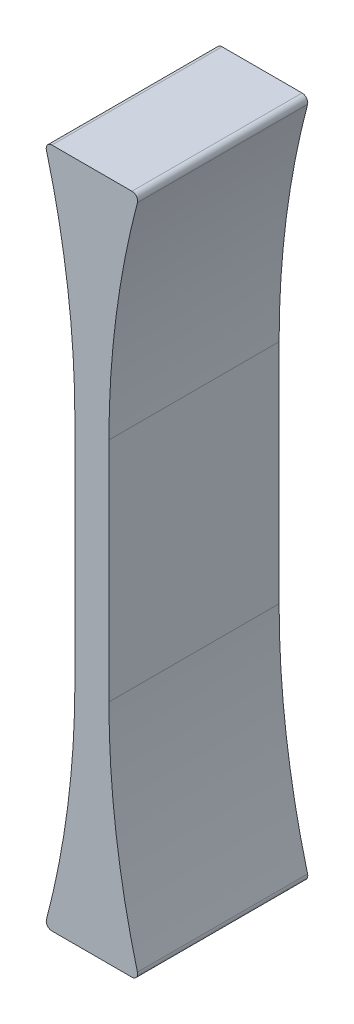
ISO-10303-21;
HEADER;
FILE_DESCRIPTION(('STEP AP214'),'2;1');
FILE_NAME('part.step','',(''),(''),'','','');
FILE_SCHEMA(('AUTOMOTIVE_DESIGN { 1 0 10303 214 1 1 1 1 }'));
ENDSEC;
DATA;
#1=APPLICATION_CONTEXT('core data for automotive mechanical design processes');
#2=APPLICATION_PROTOCOL_DEFINITION('international standard','automotive_design',2000,#1);
#3=PRODUCT_CONTEXT('',#1,'mechanical');
#4=PRODUCT('Part','Part','',(#3));
#5=PRODUCT_RELATED_PRODUCT_CATEGORY('part','',(#4));
#6=PRODUCT_DEFINITION_FORMATION('','',#4);
#7=PRODUCT_DEFINITION_CONTEXT('part definition',#1,'design');
#8=PRODUCT_DEFINITION('design','',#6,#7);
#9=PRODUCT_DEFINITION_SHAPE('','',#8);
#10=(LENGTH_UNIT() NAMED_UNIT(*) SI_UNIT(.MILLI.,.METRE.));
#11=(NAMED_UNIT(*) PLANE_ANGLE_UNIT() SI_UNIT($,.RADIAN.));
#12=(NAMED_UNIT(*) SI_UNIT($,.STERADIAN.) SOLID_ANGLE_UNIT());
#13=UNCERTAINTY_MEASURE_WITH_UNIT(LENGTH_MEASURE(1.E-05),#10,'distance_accuracy_value','');
#14=(GEOMETRIC_REPRESENTATION_CONTEXT(3) GLOBAL_UNCERTAINTY_ASSIGNED_CONTEXT((#13)) GLOBAL_UNIT_ASSIGNED_CONTEXT((#10,
#11,#12)) REPRESENTATION_CONTEXT('',''));
#15=CARTESIAN_POINT('',(0.,0.,0.));
#16=DIRECTION('',(0.,0.,1.));
#17=DIRECTION('',(1.,0.,0.));
#18=AXIS2_PLACEMENT_3D('',#15,#16,#17);
#19=CARTESIAN_POINT('',(1.5,0.,15.));
#20=DIRECTION('',(-1.,0.,0.));
#21=DIRECTION('',(0.,0.,1.));
#22=AXIS2_PLACEMENT_3D('',#19,#20,#21);
#23=PLANE('',#22);
#24=DIRECTION('',(0.,1.,0.));
#25=VECTOR('',#24,1.);
#26=CARTESIAN_POINT('',(1.5,0.,0.));
#27=LINE('',#26,#25);
#28=CARTESIAN_POINT('',(1.5,-10.,0.));
#29=VERTEX_POINT('',#28);
#30=CARTESIAN_POINT('',(1.5,10.,0.));
#31=VERTEX_POINT('',#30);
#32=EDGE_CURVE('E197',#29,#31,#27,.T.);
#33=ORIENTED_EDGE('',*,*,#32,.T.);
#34=DIRECTION('',(0.,0.,-1.));
#35=VECTOR('',#34,1.);
#36=CARTESIAN_POINT('',(1.5,10.,15.));
#37=LINE('',#36,#35);
#38=CARTESIAN_POINT('',(1.5,10.,15.));
#39=VERTEX_POINT('',#38);
#40=EDGE_CURVE('E209',#39,#31,#37,.T.);
#41=ORIENTED_EDGE('',*,*,#40,.F.);
#42=DIRECTION('',(0.,1.,0.));
#43=VECTOR('',#42,1.);
#44=CARTESIAN_POINT('',(1.5,0.,15.));
#45=LINE('',#44,#43);
#46=CARTESIAN_POINT('',(1.5,-10.,15.));
#47=VERTEX_POINT('',#46);
#48=EDGE_CURVE('E198',#47,#39,#45,.T.);
#49=ORIENTED_EDGE('',*,*,#48,.F.);
#50=DIRECTION('',(0.,0.,-1.));
#51=VECTOR('',#50,1.);
#52=CARTESIAN_POINT('',(1.5,-10.,15.));
#53=LINE('',#52,#51);
#54=EDGE_CURVE('E177',#47,#29,#53,.T.);
#55=ORIENTED_EDGE('',*,*,#54,.T.);
#56=EDGE_LOOP('',(#33,#41,#49,#55));
#57=FACE_BOUND('',#56,.T.);
#58=ADVANCED_FACE('F45',(#57),#23,.F.);
#59=CARTESIAN_POINT('',(77.5,10.,15.));
#60=DIRECTION('',(0.,0.,-1.));
#61=DIRECTION('',(-1.,0.,0.));
#62=AXIS2_PLACEMENT_3D('',#59,#60,#61);
#63=CYLINDRICAL_SURFACE('',#62,76.);
#64=CARTESIAN_POINT('',(77.5,10.,0.));
#65=DIRECTION('',(0.,0.,-1.));
#66=DIRECTION('',(-1.,0.,0.));
#67=AXIS2_PLACEMENT_3D('',#64,#65,#66);
#68=CIRCLE('',#67,76.);
#69=CARTESIAN_POINT('',(4.01051541558553,29.3725490196078,0.));
#70=VERTEX_POINT('',#69);
#71=EDGE_CURVE('E212',#31,#70,#68,.T.);
#72=ORIENTED_EDGE('',*,*,#71,.T.);
#73=DIRECTION('',(0.,0.,-1.));
#74=VECTOR('',#73,1.);
#75=CARTESIAN_POINT('',(4.01051541558554,29.3725490196078,15.));
#76=LINE('',#75,#74);
#77=CARTESIAN_POINT('',(4.01051541558553,29.3725490196078,15.));
#78=VERTEX_POINT('',#77);
#79=EDGE_CURVE('E11',#70,#78,#76,.F.);
#80=ORIENTED_EDGE('',*,*,#79,.T.);
#81=CARTESIAN_POINT('',(77.5,10.,15.));
#82=DIRECTION('',(0.,0.,-1.));
#83=DIRECTION('',(-1.,0.,0.));
#84=AXIS2_PLACEMENT_3D('',#81,#82,#83);
#85=CIRCLE('',#84,76.);
#86=EDGE_CURVE('E201',#39,#78,#85,.T.);
#87=ORIENTED_EDGE('',*,*,#86,.F.);
#88=ORIENTED_EDGE('',*,*,#40,.T.);
#89=EDGE_LOOP('',(#72,#80,#87,#88));
#90=FACE_BOUND('',#89,.T.);
#91=ADVANCED_FACE('F298',(#90),#63,.F.);
#92=CARTESIAN_POINT('',(4.17878888070656,30.,15.));
#93=DIRECTION('',(0.,-1.,0.));
#94=DIRECTION('',(0.,0.,-1.));
#95=AXIS2_PLACEMENT_3D('',#92,#93,#94);
#96=PLANE('',#95);
#97=DIRECTION('',(-1.,0.,0.));
#98=VECTOR('',#97,1.);
#99=CARTESIAN_POINT('',(4.17878888070656,30.,0.));
#100=LINE('',#99,#98);
#101=CARTESIAN_POINT('',(3.52703196437228,30.,0.));
#102=VERTEX_POINT('',#101);
#103=CARTESIAN_POINT('',(-3.52703196437229,30.,0.));
#104=VERTEX_POINT('',#103);
#105=EDGE_CURVE('E202',#102,#104,#100,.T.);
#106=ORIENTED_EDGE('',*,*,#105,.T.);
#107=DIRECTION('',(0.,0.,1.));
#108=VECTOR('',#107,1.);
#109=CARTESIAN_POINT('',(-3.52703196437229,30.,15.));
#110=LINE('',#109,#108);
#111=CARTESIAN_POINT('',(-3.52703196437229,30.,15.));
#112=VERTEX_POINT('',#111);
#113=EDGE_CURVE('E54',#104,#112,#110,.T.);
#114=ORIENTED_EDGE('',*,*,#113,.T.);
#115=DIRECTION('',(-1.,0.,0.));
#116=VECTOR('',#115,1.);
#117=CARTESIAN_POINT('',(4.17878888070656,30.,15.));
#118=LINE('',#117,#116);
#119=CARTESIAN_POINT('',(3.52703196437228,30.,15.));
#120=VERTEX_POINT('',#119);
#121=EDGE_CURVE('E205',#120,#112,#118,.T.);
#122=ORIENTED_EDGE('',*,*,#121,.F.);
#123=DIRECTION('',(0.,0.,-1.));
#124=VECTOR('',#123,1.);
#125=CARTESIAN_POINT('',(3.52703196437228,30.,15.));
#126=LINE('',#125,#124);
#127=EDGE_CURVE('E261',#120,#102,#126,.T.);
#128=ORIENTED_EDGE('',*,*,#127,.T.);
#129=EDGE_LOOP('',(#106,#114,#122,#128));
#130=FACE_BOUND('',#129,.T.);
#131=ADVANCED_FACE('F268',(#130),#96,.F.);
#132=CARTESIAN_POINT('',(77.5,10.,15.));
#133=DIRECTION('',(0.,0.,-1.));
#134=DIRECTION('',(-1.,0.,0.));
#135=AXIS2_PLACEMENT_3D('',#132,#133,#134);
#136=PLANE('',#135);
#137=CARTESIAN_POINT('',(-77.5,-10.,15.));
#138=DIRECTION('',(0.,0.,-1.));
#139=DIRECTION('',(1.,0.,0.));
#140=AXIS2_PLACEMENT_3D('',#137,#138,#139);
#141=CIRCLE('',#140,76.);
#142=CARTESIAN_POINT('',(-1.5,-10.,15.));
#143=VERTEX_POINT('',#142);
#144=CARTESIAN_POINT('',(-4.01051541558554,-29.3725490196078,15.));
#145=VERTEX_POINT('',#144);
#146=EDGE_CURVE('E141',#143,#145,#141,.T.);
#147=ORIENTED_EDGE('',*,*,#146,.T.);
#148=CARTESIAN_POINT('',(-3.52703196437229,-29.5,15.));
#149=DIRECTION('',(0.,0.,-1.));
#150=DIRECTION('',(-1.,0.,0.));
#151=AXIS2_PLACEMENT_3D('',#148,#149,#150);
#152=CIRCLE('',#151,0.5);
#153=CARTESIAN_POINT('',(-3.52703196437229,-30.,15.));
#154=VERTEX_POINT('',#153);
#155=EDGE_CURVE('E250',#145,#154,#152,.F.);
#156=ORIENTED_EDGE('',*,*,#155,.T.);
#157=DIRECTION('',(-1.,0.,0.));
#158=VECTOR('',#157,1.);
#159=CARTESIAN_POINT('',(4.17878888070656,-30.,15.));
#160=LINE('',#159,#158);
#161=CARTESIAN_POINT('',(3.52703196437228,-30.,15.));
#162=VERTEX_POINT('',#161);
#163=EDGE_CURVE('E172',#162,#154,#160,.T.);
#164=ORIENTED_EDGE('',*,*,#163,.F.);
#165=CARTESIAN_POINT('',(3.52703196437228,-29.5,15.));
#166=DIRECTION('',(0.,0.,-1.));
#167=DIRECTION('',(-1.,0.,0.));
#168=AXIS2_PLACEMENT_3D('',#165,#166,#167);
#169=CIRCLE('',#168,0.5);
#170=CARTESIAN_POINT('',(4.01051541558553,-29.3725490196078,15.));
#171=VERTEX_POINT('',#170);
#172=EDGE_CURVE('E67',#162,#171,#169,.F.);
#173=ORIENTED_EDGE('',*,*,#172,.T.);
#174=CARTESIAN_POINT('',(77.5,-10.,15.));
#175=DIRECTION('',(0.,0.,1.));
#176=DIRECTION('',(-1.,0.,0.));
#177=AXIS2_PLACEMENT_3D('',#174,#175,#176);
#178=CIRCLE('',#177,76.);
#179=EDGE_CURVE('E169',#47,#171,#178,.T.);
#180=ORIENTED_EDGE('',*,*,#179,.F.);
#181=ORIENTED_EDGE('',*,*,#48,.T.);
#182=ORIENTED_EDGE('',*,*,#86,.T.);
#183=CARTESIAN_POINT('',(3.52703196437228,29.5,15.));
#184=DIRECTION('',(0.,0.,-1.));
#185=DIRECTION('',(-1.,0.,0.));
#186=AXIS2_PLACEMENT_3D('',#183,#184,#185);
#187=CIRCLE('',#186,0.5);
#188=EDGE_CURVE('E242',#78,#120,#187,.F.);
#189=ORIENTED_EDGE('',*,*,#188,.T.);
#190=ORIENTED_EDGE('',*,*,#121,.T.);
#191=CARTESIAN_POINT('',(-3.52703196437229,29.5,15.));
#192=DIRECTION('',(0.,0.,-1.));
#193=DIRECTION('',(-1.,0.,0.));
#194=AXIS2_PLACEMENT_3D('',#191,#192,#193);
#195=CIRCLE('',#194,0.5);
#196=CARTESIAN_POINT('',(-4.01051541558554,29.3725490196078,15.));
#197=VERTEX_POINT('',#196);
#198=EDGE_CURVE('E245',#112,#197,#195,.F.);
#199=ORIENTED_EDGE('',*,*,#198,.T.);
#200=CARTESIAN_POINT('',(-77.5,10.,15.));
#201=DIRECTION('',(0.,0.,1.));
#202=DIRECTION('',(1.,0.,0.));
#203=AXIS2_PLACEMENT_3D('',#200,#201,#202);
#204=CIRCLE('',#203,76.);
#205=CARTESIAN_POINT('',(-1.5,10.,15.));
#206=VERTEX_POINT('',#205);
#207=EDGE_CURVE('E144',#206,#197,#204,.T.);
#208=ORIENTED_EDGE('',*,*,#207,.F.);
#209=DIRECTION('',(0.,1.,0.));
#210=VECTOR('',#209,1.);
#211=CARTESIAN_POINT('',(-1.5,0.,15.));
#212=LINE('',#211,#210);
#213=EDGE_CURVE('E137',#143,#206,#212,.T.);
#214=ORIENTED_EDGE('',*,*,#213,.F.);
#215=EDGE_LOOP('',(#147,#156,#164,#173,#180,#181,#182,#189,#190,#199,#208,#214));
#216=FACE_BOUND('',#215,.T.);
#217=ADVANCED_FACE('F139',(#216),#136,.F.);
#218=CARTESIAN_POINT('',(77.5,10.,0.));
#219=DIRECTION('',(0.,0.,-1.));
#220=DIRECTION('',(-1.,0.,0.));
#221=AXIS2_PLACEMENT_3D('',#218,#219,#220);
#222=PLANE('',#221);
#223=DIRECTION('',(-1.,0.,0.));
#224=VECTOR('',#223,1.);
#225=CARTESIAN_POINT('',(4.17878888070656,-30.,0.));
#226=LINE('',#225,#224);
#227=CARTESIAN_POINT('',(3.52703196437228,-30.,0.));
#228=VERTEX_POINT('',#227);
#229=CARTESIAN_POINT('',(-3.52703196437229,-30.,0.));
#230=VERTEX_POINT('',#229);
#231=EDGE_CURVE('E173',#228,#230,#226,.T.);
#232=ORIENTED_EDGE('',*,*,#231,.T.);
#233=CARTESIAN_POINT('',(-3.52703196437229,-29.5,0.));
#234=DIRECTION('',(0.,0.,-1.));
#235=DIRECTION('',(-1.,0.,0.));
#236=AXIS2_PLACEMENT_3D('',#233,#234,#235);
#237=CIRCLE('',#236,0.5);
#238=CARTESIAN_POINT('',(-4.01051541558554,-29.3725490196078,0.));
#239=VERTEX_POINT('',#238);
#240=EDGE_CURVE('E237',#230,#239,#237,.T.);
#241=ORIENTED_EDGE('',*,*,#240,.T.);
#242=CARTESIAN_POINT('',(-77.5,-10.,0.));
#243=DIRECTION('',(0.,0.,-1.));
#244=DIRECTION('',(1.,0.,0.));
#245=AXIS2_PLACEMENT_3D('',#242,#243,#244);
#246=CIRCLE('',#245,76.);
#247=CARTESIAN_POINT('',(-1.5,-10.,0.));
#248=VERTEX_POINT('',#247);
#249=EDGE_CURVE('E164',#248,#239,#246,.T.);
#250=ORIENTED_EDGE('',*,*,#249,.F.);
#251=DIRECTION('',(0.,1.,0.));
#252=VECTOR('',#251,1.);
#253=CARTESIAN_POINT('',(-1.5,0.,0.));
#254=LINE('',#253,#252);
#255=CARTESIAN_POINT('',(-1.5,10.,0.));
#256=VERTEX_POINT('',#255);
#257=EDGE_CURVE('E153',#248,#256,#254,.T.);
#258=ORIENTED_EDGE('',*,*,#257,.T.);
#259=CARTESIAN_POINT('',(-77.5,10.,0.));
#260=DIRECTION('',(0.,0.,1.));
#261=DIRECTION('',(1.,0.,0.));
#262=AXIS2_PLACEMENT_3D('',#259,#260,#261);
#263=CIRCLE('',#262,76.);
#264=CARTESIAN_POINT('',(-4.01051541558554,29.3725490196078,0.));
#265=VERTEX_POINT('',#264);
#266=EDGE_CURVE('E187',#256,#265,#263,.T.);
#267=ORIENTED_EDGE('',*,*,#266,.T.);
#268=CARTESIAN_POINT('',(-3.52703196437229,29.5,0.));
#269=DIRECTION('',(0.,0.,-1.));
#270=DIRECTION('',(-1.,0.,0.));
#271=AXIS2_PLACEMENT_3D('',#268,#269,#270);
#272=CIRCLE('',#271,0.5);
#273=EDGE_CURVE('E231',#265,#104,#272,.T.);
#274=ORIENTED_EDGE('',*,*,#273,.T.);
#275=ORIENTED_EDGE('',*,*,#105,.F.);
#276=CARTESIAN_POINT('',(3.52703196437228,29.5,0.));
#277=DIRECTION('',(0.,0.,-1.));
#278=DIRECTION('',(-1.,0.,0.));
#279=AXIS2_PLACEMENT_3D('',#276,#277,#278);
#280=CIRCLE('',#279,0.5);
#281=EDGE_CURVE('E228',#102,#70,#280,.T.);
#282=ORIENTED_EDGE('',*,*,#281,.T.);
#283=ORIENTED_EDGE('',*,*,#71,.F.);
#284=ORIENTED_EDGE('',*,*,#32,.F.);
#285=CARTESIAN_POINT('',(77.5,-10.,0.));
#286=DIRECTION('',(0.,0.,1.));
#287=DIRECTION('',(-1.,0.,0.));
#288=AXIS2_PLACEMENT_3D('',#285,#286,#287);
#289=CIRCLE('',#288,76.);
#290=CARTESIAN_POINT('',(4.01051541558553,-29.3725490196078,0.));
#291=VERTEX_POINT('',#290);
#292=EDGE_CURVE('E158',#29,#291,#289,.T.);
#293=ORIENTED_EDGE('',*,*,#292,.T.);
#294=CARTESIAN_POINT('',(3.52703196437228,-29.5,0.));
#295=DIRECTION('',(0.,0.,-1.));
#296=DIRECTION('',(-1.,0.,0.));
#297=AXIS2_PLACEMENT_3D('',#294,#295,#296);
#298=CIRCLE('',#297,0.5);
#299=EDGE_CURVE('E234',#291,#228,#298,.T.);
#300=ORIENTED_EDGE('',*,*,#299,.T.);
#301=EDGE_LOOP('',(#232,#241,#250,#258,#267,#274,#275,#282,#283,#284,#293,#300));
#302=FACE_BOUND('',#301,.T.);
#303=ADVANCED_FACE('F280',(#302),#222,.T.);
#304=CARTESIAN_POINT('',(-77.5,10.,15.));
#305=DIRECTION('',(0.,0.,-1.));
#306=DIRECTION('',(-1.,0.,0.));
#307=AXIS2_PLACEMENT_3D('',#304,#305,#306);
#308=CYLINDRICAL_SURFACE('',#307,76.);
#309=ORIENTED_EDGE('',*,*,#207,.T.);
#310=DIRECTION('',(0.,0.,-1.));
#311=VECTOR('',#310,1.);
#312=CARTESIAN_POINT('',(-4.01051541558552,29.3725490196078,15.));
#313=LINE('',#312,#311);
#314=EDGE_CURVE('E257',#197,#265,#313,.T.);
#315=ORIENTED_EDGE('',*,*,#314,.T.);
#316=ORIENTED_EDGE('',*,*,#266,.F.);
#317=DIRECTION('',(0.,0.,-1.));
#318=VECTOR('',#317,1.);
#319=CARTESIAN_POINT('',(-1.5,10.,15.));
#320=LINE('',#319,#318);
#321=EDGE_CURVE('E147',#206,#256,#320,.T.);
#322=ORIENTED_EDGE('',*,*,#321,.F.);
#323=EDGE_LOOP('',(#309,#315,#316,#322));
#324=FACE_BOUND('',#323,.T.);
#325=ADVANCED_FACE('F278',(#324),#308,.F.);
#326=CARTESIAN_POINT('',(-1.5,0.,15.));
#327=DIRECTION('',(-1.,0.,0.));
#328=DIRECTION('',(0.,-1.,0.));
#329=AXIS2_PLACEMENT_3D('',#326,#327,#328);
#330=PLANE('',#329);
#331=ORIENTED_EDGE('',*,*,#257,.F.);
#332=DIRECTION('',(0.,0.,-1.));
#333=VECTOR('',#332,1.);
#334=CARTESIAN_POINT('',(-1.5,-10.,15.));
#335=LINE('',#334,#333);
#336=EDGE_CURVE('E150',#143,#248,#335,.T.);
#337=ORIENTED_EDGE('',*,*,#336,.F.);
#338=ORIENTED_EDGE('',*,*,#213,.T.);
#339=ORIENTED_EDGE('',*,*,#321,.T.);
#340=EDGE_LOOP('',(#331,#337,#338,#339));
#341=FACE_BOUND('',#340,.T.);
#342=ADVANCED_FACE('F151',(#341),#330,.T.);
#343=CARTESIAN_POINT('',(77.5,-10.,15.));
#344=DIRECTION('',(0.,0.,-1.));
#345=DIRECTION('',(-1.,0.,0.));
#346=AXIS2_PLACEMENT_3D('',#343,#344,#345);
#347=CYLINDRICAL_SURFACE('',#346,76.);
#348=ORIENTED_EDGE('',*,*,#179,.T.);
#349=DIRECTION('',(0.,0.,-1.));
#350=VECTOR('',#349,1.);
#351=CARTESIAN_POINT('',(4.01051541558554,-29.3725490196078,15.));
#352=LINE('',#351,#350);
#353=EDGE_CURVE('E253',#171,#291,#352,.T.);
#354=ORIENTED_EDGE('',*,*,#353,.T.);
#355=ORIENTED_EDGE('',*,*,#292,.F.);
#356=ORIENTED_EDGE('',*,*,#54,.F.);
#357=EDGE_LOOP('',(#348,#354,#355,#356));
#358=FACE_BOUND('',#357,.T.);
#359=ADVANCED_FACE('F293',(#358),#347,.F.);
#360=CARTESIAN_POINT('',(4.17878888070656,-30.,15.));
#361=DIRECTION('',(0.,1.,0.));
#362=DIRECTION('',(0.,0.,-1.));
#363=AXIS2_PLACEMENT_3D('',#360,#361,#362);
#364=PLANE('',#363);
#365=ORIENTED_EDGE('',*,*,#163,.T.);
#366=DIRECTION('',(0.,0.,1.));
#367=VECTOR('',#366,1.);
#368=CARTESIAN_POINT('',(-3.52703196437229,-30.,0.));
#369=LINE('',#368,#367);
#370=EDGE_CURVE('E224',#154,#230,#369,.F.);
#371=ORIENTED_EDGE('',*,*,#370,.T.);
#372=ORIENTED_EDGE('',*,*,#231,.F.);
#373=DIRECTION('',(0.,0.,-1.));
#374=VECTOR('',#373,1.);
#375=CARTESIAN_POINT('',(3.52703196437228,-30.,15.));
#376=LINE('',#375,#374);
#377=EDGE_CURVE('E221',#228,#162,#376,.F.);
#378=ORIENTED_EDGE('',*,*,#377,.T.);
#379=EDGE_LOOP('',(#365,#371,#372,#378));
#380=FACE_BOUND('',#379,.T.);
#381=ADVANCED_FACE('F285',(#380),#364,.F.);
#382=CARTESIAN_POINT('',(-77.5,-10.,15.));
#383=DIRECTION('',(0.,0.,-1.));
#384=DIRECTION('',(-1.,0.,0.));
#385=AXIS2_PLACEMENT_3D('',#382,#383,#384);
#386=CYLINDRICAL_SURFACE('',#385,76.);
#387=ORIENTED_EDGE('',*,*,#249,.T.);
#388=DIRECTION('',(0.,0.,-1.));
#389=VECTOR('',#388,1.);
#390=CARTESIAN_POINT('',(-4.01051541558552,-29.3725490196078,15.));
#391=LINE('',#390,#389);
#392=EDGE_CURVE('E162',#239,#145,#391,.F.);
#393=ORIENTED_EDGE('',*,*,#392,.T.);
#394=ORIENTED_EDGE('',*,*,#146,.F.);
#395=ORIENTED_EDGE('',*,*,#336,.T.);
#396=EDGE_LOOP('',(#387,#393,#394,#395));
#397=FACE_BOUND('',#396,.T.);
#398=ADVANCED_FACE('F160',(#397),#386,.F.);
#399=CARTESIAN_POINT('',(-3.52703196437229,-29.5,15.));
#400=DIRECTION('',(0.,0.,-1.));
#401=DIRECTION('',(-1.,0.,0.));
#402=AXIS2_PLACEMENT_3D('',#399,#400,#401);
#403=CYLINDRICAL_SURFACE('',#402,0.5);
#404=ORIENTED_EDGE('',*,*,#155,.F.);
#405=ORIENTED_EDGE('',*,*,#392,.F.);
#406=ORIENTED_EDGE('',*,*,#240,.F.);
#407=ORIENTED_EDGE('',*,*,#370,.F.);
#408=EDGE_LOOP('',(#404,#405,#406,#407));
#409=FACE_BOUND('',#408,.T.);
#410=ADVANCED_FACE('F282',(#409),#403,.T.);
#411=CARTESIAN_POINT('',(3.52703196437228,-29.5,15.));
#412=DIRECTION('',(0.,0.,-1.));
#413=DIRECTION('',(-1.,0.,0.));
#414=AXIS2_PLACEMENT_3D('',#411,#412,#413);
#415=CYLINDRICAL_SURFACE('',#414,0.5);
#416=ORIENTED_EDGE('',*,*,#172,.F.);
#417=ORIENTED_EDGE('',*,*,#377,.F.);
#418=ORIENTED_EDGE('',*,*,#299,.F.);
#419=ORIENTED_EDGE('',*,*,#353,.F.);
#420=EDGE_LOOP('',(#416,#417,#418,#419));
#421=FACE_BOUND('',#420,.T.);
#422=ADVANCED_FACE('F289',(#421),#415,.T.);
#423=CARTESIAN_POINT('',(-3.52703196437229,29.5,15.));
#424=DIRECTION('',(0.,0.,-1.));
#425=DIRECTION('',(-1.,0.,0.));
#426=AXIS2_PLACEMENT_3D('',#423,#424,#425);
#427=CYLINDRICAL_SURFACE('',#426,0.5);
#428=ORIENTED_EDGE('',*,*,#198,.F.);
#429=ORIENTED_EDGE('',*,*,#113,.F.);
#430=ORIENTED_EDGE('',*,*,#273,.F.);
#431=ORIENTED_EDGE('',*,*,#314,.F.);
#432=EDGE_LOOP('',(#428,#429,#430,#431));
#433=FACE_BOUND('',#432,.T.);
#434=ADVANCED_FACE('F275',(#433),#427,.T.);
#435=CARTESIAN_POINT('',(3.52703196437228,29.5,15.));
#436=DIRECTION('',(0.,0.,-1.));
#437=DIRECTION('',(-1.,0.,0.));
#438=AXIS2_PLACEMENT_3D('',#435,#436,#437);
#439=CYLINDRICAL_SURFACE('',#438,0.5);
#440=ORIENTED_EDGE('',*,*,#188,.F.);
#441=ORIENTED_EDGE('',*,*,#79,.F.);
#442=ORIENTED_EDGE('',*,*,#281,.F.);
#443=ORIENTED_EDGE('',*,*,#127,.F.);
#444=EDGE_LOOP('',(#440,#441,#442,#443));
#445=FACE_BOUND('',#444,.T.);
#446=ADVANCED_FACE('F47',(#445),#439,.T.);
#447=CLOSED_SHELL('',(#58,#91,#131,#217,#303,#325,#342,#359,#381,#398,#410,#422,#434,#446));
#448=MANIFOLD_SOLID_BREP('B2',#447);
#449=ADVANCED_BREP_SHAPE_REPRESENTATION('',(#18,#448),#14);
#450=SHAPE_DEFINITION_REPRESENTATION(#9,#449);
ENDSEC;
END-ISO-10303-21;
